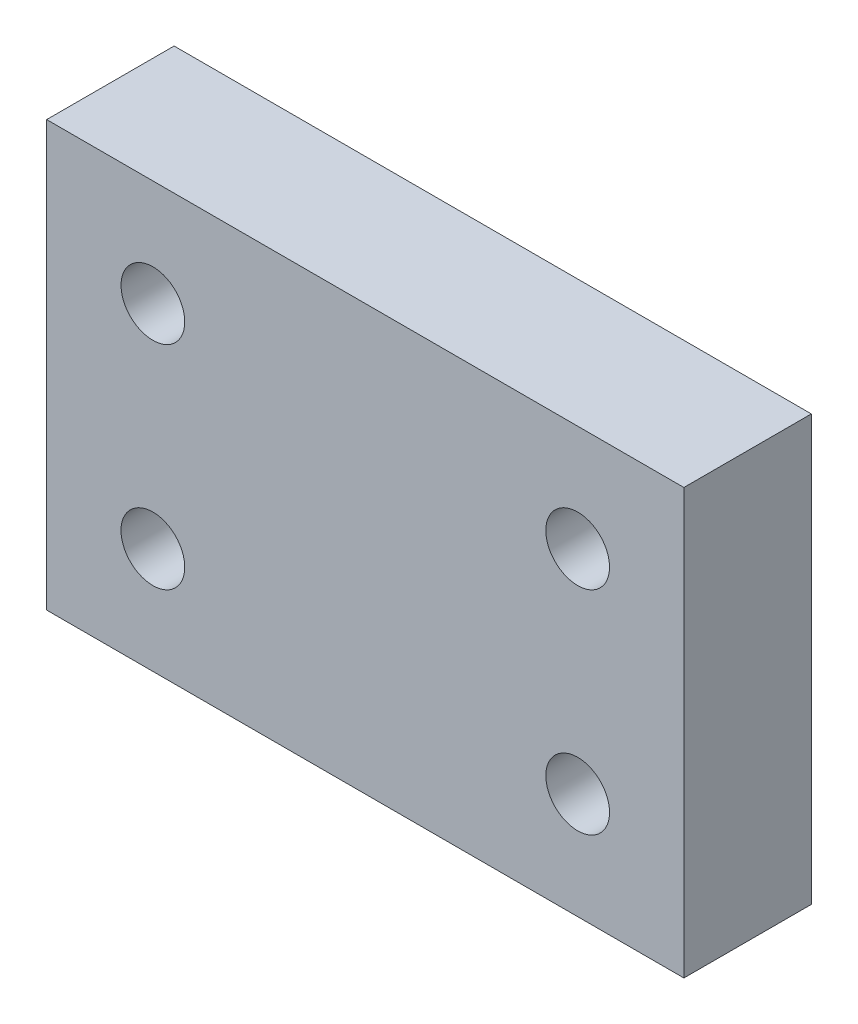
ISO-10303-21;
HEADER;
FILE_DESCRIPTION(('STEP AP214'),'2;1');
FILE_NAME('part.step','',(''),(''),'','','');
FILE_SCHEMA(('AUTOMOTIVE_DESIGN { 1 0 10303 214 1 1 1 1 }'));
ENDSEC;
DATA;
#1=APPLICATION_CONTEXT('core data for automotive mechanical design processes');
#2=APPLICATION_PROTOCOL_DEFINITION('international standard','automotive_design',2000,#1);
#3=PRODUCT_CONTEXT('',#1,'mechanical');
#4=PRODUCT('Part','Part','',(#3));
#5=PRODUCT_RELATED_PRODUCT_CATEGORY('part','',(#4));
#6=PRODUCT_DEFINITION_FORMATION('','',#4);
#7=PRODUCT_DEFINITION_CONTEXT('part definition',#1,'design');
#8=PRODUCT_DEFINITION('design','',#6,#7);
#9=PRODUCT_DEFINITION_SHAPE('','',#8);
#10=(LENGTH_UNIT() NAMED_UNIT(*) SI_UNIT(.MILLI.,.METRE.));
#11=(NAMED_UNIT(*) PLANE_ANGLE_UNIT() SI_UNIT($,.RADIAN.));
#12=(NAMED_UNIT(*) SI_UNIT($,.STERADIAN.) SOLID_ANGLE_UNIT());
#13=UNCERTAINTY_MEASURE_WITH_UNIT(LENGTH_MEASURE(1.E-05),#10,'distance_accuracy_value','');
#14=(GEOMETRIC_REPRESENTATION_CONTEXT(3) GLOBAL_UNCERTAINTY_ASSIGNED_CONTEXT((#13)) GLOBAL_UNIT_ASSIGNED_CONTEXT((#10,
#11,#12)) REPRESENTATION_CONTEXT('',''));
#15=CARTESIAN_POINT('',(0.,0.,0.));
#16=DIRECTION('',(0.,0.,1.));
#17=DIRECTION('',(1.,0.,0.));
#18=AXIS2_PLACEMENT_3D('',#15,#16,#17);
#19=CARTESIAN_POINT('',(0.,0.,6.));
#20=DIRECTION('',(0.,0.,-1.));
#21=DIRECTION('',(-1.,0.,0.));
#22=AXIS2_PLACEMENT_3D('',#19,#20,#21);
#23=PLANE('',#22);
#24=CARTESIAN_POINT('',(25.,5.,6.));
#25=DIRECTION('',(0.,0.,1.));
#26=DIRECTION('',(1.,0.,0.));
#27=AXIS2_PLACEMENT_3D('',#24,#25,#26);
#28=CIRCLE('',#27,1.5);
#29=CARTESIAN_POINT('',(26.5,5.,6.));
#30=VERTEX_POINT('',#29);
#31=EDGE_CURVE('E123',#30,#30,#28,.T.);
#32=ORIENTED_EDGE('',*,*,#31,.F.);
#33=EDGE_LOOP('',(#32));
#34=FACE_BOUND('',#33,.T.);
#35=CARTESIAN_POINT('',(5.,15.,6.));
#36=DIRECTION('',(0.,0.,1.));
#37=DIRECTION('',(1.,0.,0.));
#38=AXIS2_PLACEMENT_3D('',#35,#36,#37);
#39=CIRCLE('',#38,1.5);
#40=CARTESIAN_POINT('',(6.5,15.,6.));
#41=VERTEX_POINT('',#40);
#42=EDGE_CURVE('E102',#41,#41,#39,.T.);
#43=ORIENTED_EDGE('',*,*,#42,.F.);
#44=EDGE_LOOP('',(#43));
#45=FACE_BOUND('',#44,.T.);
#46=DIRECTION('',(0.,-1.,0.));
#47=VECTOR('',#46,1.);
#48=CARTESIAN_POINT('',(0.,0.,6.));
#49=LINE('',#48,#47);
#50=CARTESIAN_POINT('',(0.,20.,6.));
#51=VERTEX_POINT('',#50);
#52=CARTESIAN_POINT('',(0.,0.,6.));
#53=VERTEX_POINT('',#52);
#54=EDGE_CURVE('E87',#51,#53,#49,.T.);
#55=ORIENTED_EDGE('',*,*,#54,.T.);
#56=DIRECTION('',(1.,0.,0.));
#57=VECTOR('',#56,1.);
#58=CARTESIAN_POINT('',(0.,0.,6.));
#59=LINE('',#58,#57);
#60=CARTESIAN_POINT('',(30.,0.,6.));
#61=VERTEX_POINT('',#60);
#62=EDGE_CURVE('E82',#53,#61,#59,.T.);
#63=ORIENTED_EDGE('',*,*,#62,.T.);
#64=DIRECTION('',(0.,1.,0.));
#65=VECTOR('',#64,1.);
#66=CARTESIAN_POINT('',(30.,0.,6.));
#67=LINE('',#66,#65);
#68=CARTESIAN_POINT('',(30.,20.,6.));
#69=VERTEX_POINT('',#68);
#70=EDGE_CURVE('E85',#61,#69,#67,.T.);
#71=ORIENTED_EDGE('',*,*,#70,.T.);
#72=DIRECTION('',(-1.,0.,0.));
#73=VECTOR('',#72,1.);
#74=CARTESIAN_POINT('',(0.,20.,6.));
#75=LINE('',#74,#73);
#76=EDGE_CURVE('E52',#69,#51,#75,.T.);
#77=ORIENTED_EDGE('',*,*,#76,.T.);
#78=EDGE_LOOP('',(#55,#63,#71,#77));
#79=FACE_BOUND('',#78,.T.);
#80=CARTESIAN_POINT('',(25.,15.,6.));
#81=DIRECTION('',(0.,0.,1.));
#82=DIRECTION('',(-1.,0.,0.));
#83=AXIS2_PLACEMENT_3D('',#80,#81,#82);
#84=CIRCLE('',#83,1.5);
#85=CARTESIAN_POINT('',(23.5,15.,6.));
#86=VERTEX_POINT('',#85);
#87=EDGE_CURVE('E117',#86,#86,#84,.T.);
#88=ORIENTED_EDGE('',*,*,#87,.F.);
#89=EDGE_LOOP('',(#88));
#90=FACE_BOUND('',#89,.T.);
#91=CARTESIAN_POINT('',(5.,5.,6.));
#92=DIRECTION('',(0.,0.,1.));
#93=DIRECTION('',(-1.,0.,0.));
#94=AXIS2_PLACEMENT_3D('',#91,#92,#93);
#95=CIRCLE('',#94,1.5);
#96=CARTESIAN_POINT('',(3.5,5.,6.));
#97=VERTEX_POINT('',#96);
#98=EDGE_CURVE('E129',#97,#97,#95,.T.);
#99=ORIENTED_EDGE('',*,*,#98,.F.);
#100=EDGE_LOOP('',(#99));
#101=FACE_BOUND('',#100,.T.);
#102=ADVANCED_FACE('F35',(#34,#45,#79,#90,#101),#23,.F.);
#103=CARTESIAN_POINT('',(0.,0.,0.));
#104=DIRECTION('',(0.,0.,-1.));
#105=DIRECTION('',(-1.,0.,0.));
#106=AXIS2_PLACEMENT_3D('',#103,#104,#105);
#107=PLANE('',#106);
#108=CARTESIAN_POINT('',(25.,5.,0.));
#109=DIRECTION('',(0.,0.,1.));
#110=DIRECTION('',(1.,0.,0.));
#111=AXIS2_PLACEMENT_3D('',#108,#109,#110);
#112=CIRCLE('',#111,1.5);
#113=CARTESIAN_POINT('',(26.5,5.,0.));
#114=VERTEX_POINT('',#113);
#115=EDGE_CURVE('E126',#114,#114,#112,.T.);
#116=ORIENTED_EDGE('',*,*,#115,.T.);
#117=EDGE_LOOP('',(#116));
#118=FACE_BOUND('',#117,.T.);
#119=CARTESIAN_POINT('',(5.,15.,0.));
#120=DIRECTION('',(0.,0.,1.));
#121=DIRECTION('',(1.,0.,0.));
#122=AXIS2_PLACEMENT_3D('',#119,#120,#121);
#123=CIRCLE('',#122,1.5);
#124=CARTESIAN_POINT('',(6.5,15.,0.));
#125=VERTEX_POINT('',#124);
#126=EDGE_CURVE('E114',#125,#125,#123,.T.);
#127=ORIENTED_EDGE('',*,*,#126,.T.);
#128=EDGE_LOOP('',(#127));
#129=FACE_BOUND('',#128,.T.);
#130=DIRECTION('',(0.,-1.,0.));
#131=VECTOR('',#130,1.);
#132=CARTESIAN_POINT('',(0.,0.,0.));
#133=LINE('',#132,#131);
#134=CARTESIAN_POINT('',(0.,20.,0.));
#135=VERTEX_POINT('',#134);
#136=CARTESIAN_POINT('',(0.,0.,0.));
#137=VERTEX_POINT('',#136);
#138=EDGE_CURVE('E99',#135,#137,#133,.T.);
#139=ORIENTED_EDGE('',*,*,#138,.F.);
#140=DIRECTION('',(-1.,0.,0.));
#141=VECTOR('',#140,1.);
#142=CARTESIAN_POINT('',(0.,20.,0.));
#143=LINE('',#142,#141);
#144=CARTESIAN_POINT('',(30.,20.,0.));
#145=VERTEX_POINT('',#144);
#146=EDGE_CURVE('E75',#145,#135,#143,.T.);
#147=ORIENTED_EDGE('',*,*,#146,.F.);
#148=DIRECTION('',(0.,1.,0.));
#149=VECTOR('',#148,1.);
#150=CARTESIAN_POINT('',(30.,0.,0.));
#151=LINE('',#150,#149);
#152=CARTESIAN_POINT('',(30.,0.,0.));
#153=VERTEX_POINT('',#152);
#154=EDGE_CURVE('E69',#153,#145,#151,.T.);
#155=ORIENTED_EDGE('',*,*,#154,.F.);
#156=DIRECTION('',(1.,0.,0.));
#157=VECTOR('',#156,1.);
#158=CARTESIAN_POINT('',(0.,0.,0.));
#159=LINE('',#158,#157);
#160=EDGE_CURVE('E91',#137,#153,#159,.T.);
#161=ORIENTED_EDGE('',*,*,#160,.F.);
#162=EDGE_LOOP('',(#139,#147,#155,#161));
#163=FACE_BOUND('',#162,.T.);
#164=CARTESIAN_POINT('',(25.,15.,0.));
#165=DIRECTION('',(0.,0.,1.));
#166=DIRECTION('',(-1.,0.,0.));
#167=AXIS2_PLACEMENT_3D('',#164,#165,#166);
#168=CIRCLE('',#167,1.5);
#169=CARTESIAN_POINT('',(23.5,15.,0.));
#170=VERTEX_POINT('',#169);
#171=EDGE_CURVE('E120',#170,#170,#168,.T.);
#172=ORIENTED_EDGE('',*,*,#171,.T.);
#173=EDGE_LOOP('',(#172));
#174=FACE_BOUND('',#173,.T.);
#175=CARTESIAN_POINT('',(5.,5.,0.));
#176=DIRECTION('',(0.,0.,1.));
#177=DIRECTION('',(-1.,0.,0.));
#178=AXIS2_PLACEMENT_3D('',#175,#176,#177);
#179=CIRCLE('',#178,1.5);
#180=CARTESIAN_POINT('',(3.5,5.,0.));
#181=VERTEX_POINT('',#180);
#182=EDGE_CURVE('E132',#181,#181,#179,.T.);
#183=ORIENTED_EDGE('',*,*,#182,.T.);
#184=EDGE_LOOP('',(#183));
#185=FACE_BOUND('',#184,.T.);
#186=ADVANCED_FACE('F110',(#118,#129,#163,#174,#185),#107,.T.);
#187=CARTESIAN_POINT('',(0.,0.,6.));
#188=DIRECTION('',(1.,0.,0.));
#189=DIRECTION('',(0.,0.,-1.));
#190=AXIS2_PLACEMENT_3D('',#187,#188,#189);
#191=PLANE('',#190);
#192=ORIENTED_EDGE('',*,*,#138,.T.);
#193=DIRECTION('',(0.,0.,-1.));
#194=VECTOR('',#193,1.);
#195=CARTESIAN_POINT('',(0.,0.,6.));
#196=LINE('',#195,#194);
#197=EDGE_CURVE('E11',#53,#137,#196,.T.);
#198=ORIENTED_EDGE('',*,*,#197,.F.);
#199=ORIENTED_EDGE('',*,*,#54,.F.);
#200=DIRECTION('',(0.,0.,-1.));
#201=VECTOR('',#200,1.);
#202=CARTESIAN_POINT('',(0.,20.,6.));
#203=LINE('',#202,#201);
#204=EDGE_CURVE('E95',#51,#135,#203,.T.);
#205=ORIENTED_EDGE('',*,*,#204,.T.);
#206=EDGE_LOOP('',(#192,#198,#199,#205));
#207=FACE_BOUND('',#206,.T.);
#208=ADVANCED_FACE('F37',(#207),#191,.F.);
#209=CARTESIAN_POINT('',(0.,0.,6.));
#210=DIRECTION('',(0.,1.,0.));
#211=DIRECTION('',(0.,0.,1.));
#212=AXIS2_PLACEMENT_3D('',#209,#210,#211);
#213=PLANE('',#212);
#214=ORIENTED_EDGE('',*,*,#160,.T.);
#215=DIRECTION('',(0.,0.,-1.));
#216=VECTOR('',#215,1.);
#217=CARTESIAN_POINT('',(30.,0.,6.));
#218=LINE('',#217,#216);
#219=EDGE_CURVE('E44',#61,#153,#218,.T.);
#220=ORIENTED_EDGE('',*,*,#219,.F.);
#221=ORIENTED_EDGE('',*,*,#62,.F.);
#222=ORIENTED_EDGE('',*,*,#197,.T.);
#223=EDGE_LOOP('',(#214,#220,#221,#222));
#224=FACE_BOUND('',#223,.T.);
#225=ADVANCED_FACE('F90',(#224),#213,.F.);
#226=CARTESIAN_POINT('',(30.,0.,6.));
#227=DIRECTION('',(-1.,0.,0.));
#228=DIRECTION('',(0.,0.,1.));
#229=AXIS2_PLACEMENT_3D('',#226,#227,#228);
#230=PLANE('',#229);
#231=ORIENTED_EDGE('',*,*,#154,.T.);
#232=DIRECTION('',(0.,0.,-1.));
#233=VECTOR('',#232,1.);
#234=CARTESIAN_POINT('',(30.,20.,6.));
#235=LINE('',#234,#233);
#236=EDGE_CURVE('E92',#69,#145,#235,.T.);
#237=ORIENTED_EDGE('',*,*,#236,.F.);
#238=ORIENTED_EDGE('',*,*,#70,.F.);
#239=ORIENTED_EDGE('',*,*,#219,.T.);
#240=EDGE_LOOP('',(#231,#237,#238,#239));
#241=FACE_BOUND('',#240,.T.);
#242=ADVANCED_FACE('F93',(#241),#230,.F.);
#243=CARTESIAN_POINT('',(0.,20.,6.));
#244=DIRECTION('',(0.,-1.,0.));
#245=DIRECTION('',(0.,0.,-1.));
#246=AXIS2_PLACEMENT_3D('',#243,#244,#245);
#247=PLANE('',#246);
#248=ORIENTED_EDGE('',*,*,#146,.T.);
#249=ORIENTED_EDGE('',*,*,#204,.F.);
#250=ORIENTED_EDGE('',*,*,#76,.F.);
#251=ORIENTED_EDGE('',*,*,#236,.T.);
#252=EDGE_LOOP('',(#248,#249,#250,#251));
#253=FACE_BOUND('',#252,.T.);
#254=ADVANCED_FACE('F107',(#253),#247,.F.);
#255=CARTESIAN_POINT('',(5.,15.,6.));
#256=DIRECTION('',(0.,0.,-1.));
#257=DIRECTION('',(-1.,0.,0.));
#258=AXIS2_PLACEMENT_3D('',#255,#256,#257);
#259=CYLINDRICAL_SURFACE('',#258,1.5);
#260=ORIENTED_EDGE('',*,*,#42,.T.);
#261=EDGE_LOOP('',(#260));
#262=FACE_BOUND('',#261,.T.);
#263=ORIENTED_EDGE('',*,*,#126,.F.);
#264=EDGE_LOOP('',(#263));
#265=FACE_BOUND('',#264,.T.);
#266=ADVANCED_FACE('F152',(#262,#265),#259,.F.);
#267=CARTESIAN_POINT('',(25.,15.,6.));
#268=DIRECTION('',(0.,0.,-1.));
#269=DIRECTION('',(-1.,0.,0.));
#270=AXIS2_PLACEMENT_3D('',#267,#268,#269);
#271=CYLINDRICAL_SURFACE('',#270,1.5);
#272=ORIENTED_EDGE('',*,*,#87,.T.);
#273=EDGE_LOOP('',(#272));
#274=FACE_BOUND('',#273,.T.);
#275=ORIENTED_EDGE('',*,*,#171,.F.);
#276=EDGE_LOOP('',(#275));
#277=FACE_BOUND('',#276,.T.);
#278=ADVANCED_FACE('F198',(#274,#277),#271,.F.);
#279=CARTESIAN_POINT('',(25.,5.,6.));
#280=DIRECTION('',(0.,0.,-1.));
#281=DIRECTION('',(-1.,0.,0.));
#282=AXIS2_PLACEMENT_3D('',#279,#280,#281);
#283=CYLINDRICAL_SURFACE('',#282,1.5);
#284=ORIENTED_EDGE('',*,*,#31,.T.);
#285=EDGE_LOOP('',(#284));
#286=FACE_BOUND('',#285,.T.);
#287=ORIENTED_EDGE('',*,*,#115,.F.);
#288=EDGE_LOOP('',(#287));
#289=FACE_BOUND('',#288,.T.);
#290=ADVANCED_FACE('F206',(#286,#289),#283,.F.);
#291=CARTESIAN_POINT('',(5.,5.,6.));
#292=DIRECTION('',(0.,0.,-1.));
#293=DIRECTION('',(-1.,0.,0.));
#294=AXIS2_PLACEMENT_3D('',#291,#292,#293);
#295=CYLINDRICAL_SURFACE('',#294,1.5);
#296=ORIENTED_EDGE('',*,*,#98,.T.);
#297=EDGE_LOOP('',(#296));
#298=FACE_BOUND('',#297,.T.);
#299=ORIENTED_EDGE('',*,*,#182,.F.);
#300=EDGE_LOOP('',(#299));
#301=FACE_BOUND('',#300,.T.);
#302=ADVANCED_FACE('F138',(#298,#301),#295,.F.);
#303=CLOSED_SHELL('',(#102,#186,#208,#225,#242,#254,#266,#278,#290,#302));
#304=MANIFOLD_SOLID_BREP('B2',#303);
#305=ADVANCED_BREP_SHAPE_REPRESENTATION('',(#18,#304),#14);
#306=SHAPE_DEFINITION_REPRESENTATION(#9,#305);
ENDSEC;
END-ISO-10303-21;
